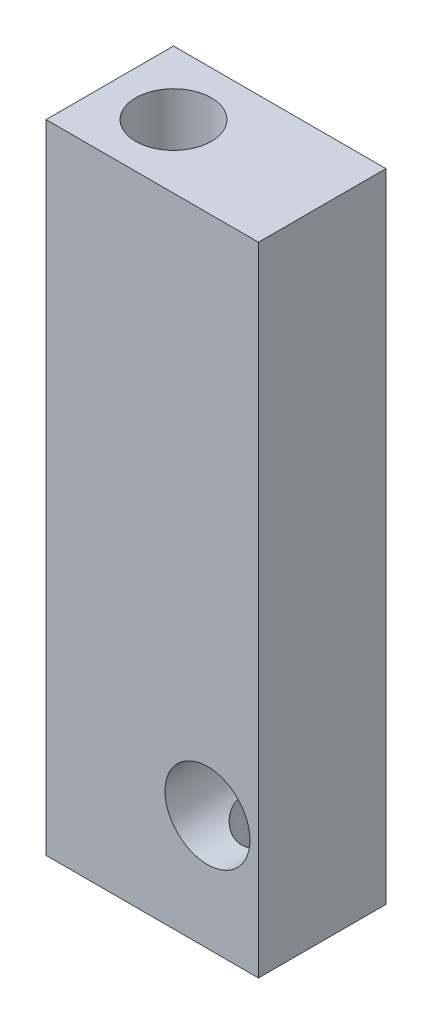
ISO-10303-21;
HEADER;
FILE_DESCRIPTION(('STEP AP214'),'2;1');
FILE_NAME('part.step','',(''),(''),'','','');
FILE_SCHEMA(('AUTOMOTIVE_DESIGN { 1 0 10303 214 1 1 1 1 }'));
ENDSEC;
DATA;
#1=APPLICATION_CONTEXT('core data for automotive mechanical design processes');
#2=APPLICATION_PROTOCOL_DEFINITION('international standard','automotive_design',2000,#1);
#3=PRODUCT_CONTEXT('',#1,'mechanical');
#4=PRODUCT('Part','Part','',(#3));
#5=PRODUCT_RELATED_PRODUCT_CATEGORY('part','',(#4));
#6=PRODUCT_DEFINITION_FORMATION('','',#4);
#7=PRODUCT_DEFINITION_CONTEXT('part definition',#1,'design');
#8=PRODUCT_DEFINITION('design','',#6,#7);
#9=PRODUCT_DEFINITION_SHAPE('','',#8);
#10=(LENGTH_UNIT() NAMED_UNIT(*) SI_UNIT(.MILLI.,.METRE.));
#11=(NAMED_UNIT(*) PLANE_ANGLE_UNIT() SI_UNIT($,.RADIAN.));
#12=(NAMED_UNIT(*) SI_UNIT($,.STERADIAN.) SOLID_ANGLE_UNIT());
#13=UNCERTAINTY_MEASURE_WITH_UNIT(LENGTH_MEASURE(1.E-05),#10,'distance_accuracy_value','');
#14=(GEOMETRIC_REPRESENTATION_CONTEXT(3) GLOBAL_UNCERTAINTY_ASSIGNED_CONTEXT((#13)) GLOBAL_UNIT_ASSIGNED_CONTEXT((#10,
#11,#12)) REPRESENTATION_CONTEXT('',''));
#15=CARTESIAN_POINT('',(0.,0.,0.));
#16=DIRECTION('',(0.,0.,1.));
#17=DIRECTION('',(1.,0.,0.));
#18=AXIS2_PLACEMENT_3D('',#15,#16,#17);
#19=CARTESIAN_POINT('',(3.175,-19.05,1.905));
#20=DIRECTION('',(1.,0.,0.));
#21=DIRECTION('',(0.,0.,-1.));
#22=AXIS2_PLACEMENT_3D('',#19,#20,#21);
#23=PLANE('',#22);
#24=DIRECTION('',(0.,0.,-1.));
#25=VECTOR('',#24,1.);
#26=CARTESIAN_POINT('',(3.175,0.,1.905));
#27=LINE('',#26,#25);
#28=CARTESIAN_POINT('',(3.175,0.,1.905));
#29=VERTEX_POINT('',#28);
#30=CARTESIAN_POINT('',(3.175,0.,-1.905));
#31=VERTEX_POINT('',#30);
#32=EDGE_CURVE('E97',#29,#31,#27,.T.);
#33=ORIENTED_EDGE('',*,*,#32,.F.);
#34=DIRECTION('',(0.,1.,0.));
#35=VECTOR('',#34,1.);
#36=CARTESIAN_POINT('',(3.175,-19.05,1.905));
#37=LINE('',#36,#35);
#38=CARTESIAN_POINT('',(3.175,-19.05,1.905));
#39=VERTEX_POINT('',#38);
#40=EDGE_CURVE('E11',#39,#29,#37,.T.);
#41=ORIENTED_EDGE('',*,*,#40,.F.);
#42=DIRECTION('',(0.,0.,-1.));
#43=VECTOR('',#42,1.);
#44=CARTESIAN_POINT('',(3.175,-19.05,1.905));
#45=LINE('',#44,#43);
#46=CARTESIAN_POINT('',(3.175,-19.05,-1.905));
#47=VERTEX_POINT('',#46);
#48=EDGE_CURVE('E108',#39,#47,#45,.T.);
#49=ORIENTED_EDGE('',*,*,#48,.T.);
#50=DIRECTION('',(0.,1.,0.));
#51=VECTOR('',#50,1.);
#52=CARTESIAN_POINT('',(3.175,-19.05,-1.905));
#53=LINE('',#52,#51);
#54=EDGE_CURVE('E41',#47,#31,#53,.T.);
#55=ORIENTED_EDGE('',*,*,#54,.T.);
#56=EDGE_LOOP('',(#33,#41,#49,#55));
#57=FACE_BOUND('',#56,.T.);
#58=ADVANCED_FACE('F38',(#57),#23,.T.);
#59=CARTESIAN_POINT('',(-3.175,-19.05,1.905));
#60=DIRECTION('',(0.,0.,1.));
#61=DIRECTION('',(1.,0.,0.));
#62=AXIS2_PLACEMENT_3D('',#59,#60,#61);
#63=PLANE('',#62);
#64=CARTESIAN_POINT('',(1.651,-15.60576,1.905));
#65=DIRECTION('',(0.,0.,1.));
#66=DIRECTION('',(1.,0.,0.));
#67=AXIS2_PLACEMENT_3D('',#64,#65,#66);
#68=CIRCLE('',#67,1.27);
#69=CARTESIAN_POINT('',(2.921,-15.60576,1.905));
#70=VERTEX_POINT('',#69);
#71=EDGE_CURVE('E155',#70,#70,#68,.T.);
#72=ORIENTED_EDGE('',*,*,#71,.F.);
#73=EDGE_LOOP('',(#72));
#74=FACE_BOUND('',#73,.T.);
#75=DIRECTION('',(1.,0.,0.));
#76=VECTOR('',#75,1.);
#77=CARTESIAN_POINT('',(-3.175,0.,1.905));
#78=LINE('',#77,#76);
#79=CARTESIAN_POINT('',(-3.175,0.,1.905));
#80=VERTEX_POINT('',#79);
#81=EDGE_CURVE('E111',#80,#29,#78,.T.);
#82=ORIENTED_EDGE('',*,*,#81,.F.);
#83=DIRECTION('',(0.,1.,0.));
#84=VECTOR('',#83,1.);
#85=CARTESIAN_POINT('',(-3.175,-19.05,1.905));
#86=LINE('',#85,#84);
#87=CARTESIAN_POINT('',(-3.175,-19.05,1.905));
#88=VERTEX_POINT('',#87);
#89=EDGE_CURVE('E47',#88,#80,#86,.T.);
#90=ORIENTED_EDGE('',*,*,#89,.F.);
#91=DIRECTION('',(1.,0.,0.));
#92=VECTOR('',#91,1.);
#93=CARTESIAN_POINT('',(-3.175,-19.05,1.905));
#94=LINE('',#93,#92);
#95=EDGE_CURVE('E115',#88,#39,#94,.T.);
#96=ORIENTED_EDGE('',*,*,#95,.T.);
#97=ORIENTED_EDGE('',*,*,#40,.T.);
#98=EDGE_LOOP('',(#82,#90,#96,#97));
#99=FACE_BOUND('',#98,.T.);
#100=ADVANCED_FACE('F126',(#74,#99),#63,.T.);
#101=CARTESIAN_POINT('',(-3.175,-19.05,1.905));
#102=DIRECTION('',(-1.,0.,0.));
#103=DIRECTION('',(0.,0.,1.));
#104=AXIS2_PLACEMENT_3D('',#101,#102,#103);
#105=PLANE('',#104);
#106=DIRECTION('',(0.,0.,1.));
#107=VECTOR('',#106,1.);
#108=CARTESIAN_POINT('',(-3.175,0.,1.905));
#109=LINE('',#108,#107);
#110=CARTESIAN_POINT('',(-3.175,0.,-1.905));
#111=VERTEX_POINT('',#110);
#112=EDGE_CURVE('E119',#111,#80,#109,.T.);
#113=ORIENTED_EDGE('',*,*,#112,.F.);
#114=DIRECTION('',(0.,1.,0.));
#115=VECTOR('',#114,1.);
#116=CARTESIAN_POINT('',(-3.175,-19.05,-1.905));
#117=LINE('',#116,#115);
#118=CARTESIAN_POINT('',(-3.175,-19.05,-1.905));
#119=VERTEX_POINT('',#118);
#120=EDGE_CURVE('E123',#119,#111,#117,.T.);
#121=ORIENTED_EDGE('',*,*,#120,.F.);
#122=DIRECTION('',(0.,0.,1.));
#123=VECTOR('',#122,1.);
#124=CARTESIAN_POINT('',(-3.175,-19.05,1.905));
#125=LINE('',#124,#123);
#126=EDGE_CURVE('E113',#119,#88,#125,.T.);
#127=ORIENTED_EDGE('',*,*,#126,.T.);
#128=ORIENTED_EDGE('',*,*,#89,.T.);
#129=EDGE_LOOP('',(#113,#121,#127,#128));
#130=FACE_BOUND('',#129,.T.);
#131=ADVANCED_FACE('F129',(#130),#105,.T.);
#132=CARTESIAN_POINT('',(-3.175,-19.05,-1.905));
#133=DIRECTION('',(0.,0.,-1.));
#134=DIRECTION('',(-1.,0.,0.));
#135=AXIS2_PLACEMENT_3D('',#132,#133,#134);
#136=PLANE('',#135);
#137=CARTESIAN_POINT('',(1.651,-15.60576,-1.905));
#138=DIRECTION('',(0.,0.,1.));
#139=DIRECTION('',(1.,0.,0.));
#140=AXIS2_PLACEMENT_3D('',#137,#138,#139);
#141=CIRCLE('',#140,1.27);
#142=CARTESIAN_POINT('',(2.921,-15.60576,-1.905));
#143=VERTEX_POINT('',#142);
#144=EDGE_CURVE('E104',#143,#143,#141,.T.);
#145=ORIENTED_EDGE('',*,*,#144,.T.);
#146=EDGE_LOOP('',(#145));
#147=FACE_BOUND('',#146,.T.);
#148=DIRECTION('',(-1.,0.,0.));
#149=VECTOR('',#148,1.);
#150=CARTESIAN_POINT('',(-3.175,0.,-1.905));
#151=LINE('',#150,#149);
#152=EDGE_CURVE('E101',#31,#111,#151,.T.);
#153=ORIENTED_EDGE('',*,*,#152,.F.);
#154=ORIENTED_EDGE('',*,*,#54,.F.);
#155=DIRECTION('',(-1.,0.,0.));
#156=VECTOR('',#155,1.);
#157=CARTESIAN_POINT('',(-3.175,-19.05,-1.905));
#158=LINE('',#157,#156);
#159=EDGE_CURVE('E110',#47,#119,#158,.T.);
#160=ORIENTED_EDGE('',*,*,#159,.T.);
#161=ORIENTED_EDGE('',*,*,#120,.T.);
#162=EDGE_LOOP('',(#153,#154,#160,#161));
#163=FACE_BOUND('',#162,.T.);
#164=ADVANCED_FACE('F124',(#147,#163),#136,.T.);
#165=CARTESIAN_POINT('',(0.,-19.05,0.));
#166=DIRECTION('',(0.,-1.,0.));
#167=DIRECTION('',(0.,0.,-1.));
#168=AXIS2_PLACEMENT_3D('',#165,#166,#167);
#169=PLANE('',#168);
#170=CARTESIAN_POINT('',(1.651,-19.05,0.));
#171=DIRECTION('',(0.,-1.,0.));
#172=DIRECTION('',(0.,0.,-1.));
#173=AXIS2_PLACEMENT_3D('',#170,#171,#172);
#174=CIRCLE('',#173,0.888999999999987);
#175=CARTESIAN_POINT('',(1.651,-19.05,-0.888999999999987));
#176=VERTEX_POINT('',#175);
#177=EDGE_CURVE('E161',#176,#176,#174,.T.);
#178=ORIENTED_EDGE('',*,*,#177,.F.);
#179=EDGE_LOOP('',(#178));
#180=FACE_BOUND('',#179,.T.);
#181=ORIENTED_EDGE('',*,*,#48,.F.);
#182=ORIENTED_EDGE('',*,*,#95,.F.);
#183=ORIENTED_EDGE('',*,*,#126,.F.);
#184=ORIENTED_EDGE('',*,*,#159,.F.);
#185=EDGE_LOOP('',(#181,#182,#183,#184));
#186=FACE_BOUND('',#185,.T.);
#187=ADVANCED_FACE('F131',(#180,#186),#169,.T.);
#188=CARTESIAN_POINT('',(0.,0.,0.));
#189=DIRECTION('',(0.,-1.,0.));
#190=DIRECTION('',(0.,0.,-1.));
#191=AXIS2_PLACEMENT_3D('',#188,#189,#190);
#192=PLANE('',#191);
#193=CARTESIAN_POINT('',(-1.27,0.,0.));
#194=DIRECTION('',(0.,1.,0.));
#195=DIRECTION('',(0.,0.,1.));
#196=AXIS2_PLACEMENT_3D('',#193,#194,#195);
#197=CIRCLE('',#196,1.13029999999999);
#198=CARTESIAN_POINT('',(-1.27,0.,1.13029999999999));
#199=VERTEX_POINT('',#198);
#200=EDGE_CURVE('E98',#199,#199,#197,.T.);
#201=ORIENTED_EDGE('',*,*,#200,.F.);
#202=EDGE_LOOP('',(#201));
#203=FACE_BOUND('',#202,.T.);
#204=ORIENTED_EDGE('',*,*,#32,.T.);
#205=ORIENTED_EDGE('',*,*,#152,.T.);
#206=ORIENTED_EDGE('',*,*,#112,.T.);
#207=ORIENTED_EDGE('',*,*,#81,.T.);
#208=EDGE_LOOP('',(#204,#205,#206,#207));
#209=FACE_BOUND('',#208,.T.);
#210=ADVANCED_FACE('F91',(#203,#209),#192,.F.);
#211=CARTESIAN_POINT('',(-1.27,-7.62,0.));
#212=DIRECTION('',(0.,1.,0.));
#213=DIRECTION('',(0.,0.,1.));
#214=AXIS2_PLACEMENT_3D('',#211,#212,#213);
#215=CONICAL_SURFACE('',#214,1.13029999999999,1.02974425867665);
#216=CARTESIAN_POINT('',(-1.27,-8.29915275768685,0.));
#217=VERTEX_POINT('',#216);
#218=VERTEX_LOOP('',#217);
#219=FACE_BOUND('',#218,.T.);
#220=CARTESIAN_POINT('',(-1.27,-7.62,0.));
#221=DIRECTION('',(0.,1.,0.));
#222=DIRECTION('',(0.,0.,1.));
#223=AXIS2_PLACEMENT_3D('',#220,#221,#222);
#224=CIRCLE('',#223,1.13029999999999);
#225=CARTESIAN_POINT('',(-1.27,-7.62,1.13029999999999));
#226=VERTEX_POINT('',#225);
#227=EDGE_CURVE('E95',#226,#226,#224,.T.);
#228=ORIENTED_EDGE('',*,*,#227,.T.);
#229=EDGE_LOOP('',(#228));
#230=FACE_BOUND('',#229,.T.);
#231=ADVANCED_FACE('F87',(#219,#230),#215,.F.);
#232=CARTESIAN_POINT('',(-1.27,0.,0.));
#233=DIRECTION('',(0.,1.,0.));
#234=DIRECTION('',(0.,0.,1.));
#235=AXIS2_PLACEMENT_3D('',#232,#233,#234);
#236=CYLINDRICAL_SURFACE('',#235,1.13029999999999);
#237=ORIENTED_EDGE('',*,*,#227,.F.);
#238=EDGE_LOOP('',(#237));
#239=FACE_BOUND('',#238,.T.);
#240=ORIENTED_EDGE('',*,*,#200,.T.);
#241=EDGE_LOOP('',(#240));
#242=FACE_BOUND('',#241,.T.);
#243=ADVANCED_FACE('F90',(#239,#242),#236,.F.);
#244=CARTESIAN_POINT('',(1.651,-15.60576,-1.905));
#245=DIRECTION('',(0.,0.,1.));
#246=DIRECTION('',(1.,0.,0.));
#247=AXIS2_PLACEMENT_3D('',#244,#245,#246);
#248=CYLINDRICAL_SURFACE('',#247,1.27);
#249=CARTESIAN_POINT('',(1.651,-16.87576,-0.888999999999993));
#250=CARTESIAN_POINT('',(1.69520985856038,-16.8757621231107,-0.889002293614275));
#251=CARTESIAN_POINT('',(1.73940791377723,-16.8734330924957,-0.885685048350347));
#252=CARTESIAN_POINT('',(1.82637877140825,-16.8643522508823,-0.872638182748699));
#253=CARTESIAN_POINT('',(1.86915114803012,-16.8575991308079,-0.862906664439805));
#254=CARTESIAN_POINT('',(1.95187876962086,-16.8403254937155,-0.837649704148341));
#255=CARTESIAN_POINT('',(1.99184655034182,-16.8298232141954,-0.82215229475671));
#256=CARTESIAN_POINT('',(2.06842152305637,-16.8058728374849,-0.78604966068939));
#257=CARTESIAN_POINT('',(2.10502822356792,-16.7924243104428,-0.765443690627));
#258=CARTESIAN_POINT('',(2.1774991271549,-16.762208386881,-0.717750090039023));
#259=CARTESIAN_POINT('',(2.21301218301731,-16.7452527691071,-0.690250725814769));
#260=CARTESIAN_POINT('',(2.27924215366177,-16.7101243170559,-0.630574252028733));
#261=CARTESIAN_POINT('',(2.30995174500995,-16.6919496833738,-0.598390141503373));
#262=CARTESIAN_POINT('',(2.37124965052125,-16.6525112610016,-0.52372832325559));
#263=CARTESIAN_POINT('',(2.40086471506084,-16.6312669535852,-0.480435938575854));
#264=CARTESIAN_POINT('',(2.45241613829321,-16.5915033335513,-0.388363084960961));
#265=CARTESIAN_POINT('',(2.4743653395883,-16.5729794938129,-0.339591977493894));
#266=CARTESIAN_POINT('',(2.50400950316551,-16.5467904023938,-0.253145209392162));
#267=CARTESIAN_POINT('',(2.51401494725038,-16.5375401894363,-0.216747917682053));
#268=CARTESIAN_POINT('',(2.52936859443232,-16.5230832019971,-0.142233112968697));
#269=CARTESIAN_POINT('',(2.53472591478366,-16.5178685140502,-0.104119122517421));
#270=CARTESIAN_POINT('',(2.54043829956461,-16.5123017262679,-0.0269255092800132));
#271=CARTESIAN_POINT('',(2.54076467963489,-16.5119775101226,0.0121583790184601));
#272=CARTESIAN_POINT('',(2.53631172777489,-16.5163263915972,0.0897619360053206));
#273=CARTESIAN_POINT('',(2.53152888424551,-16.5210029262646,0.128281198166042));
#274=CARTESIAN_POINT('',(2.51769232418687,-16.534105681041,0.201124287261301));
#275=CARTESIAN_POINT('',(2.50894141037512,-16.5422639698316,0.235557206491254));
#276=CARTESIAN_POINT('',(2.48770354055884,-16.561286287639,0.302459980192075));
#277=CARTESIAN_POINT('',(2.47521358930994,-16.5721524847161,0.334928235660962));
#278=CARTESIAN_POINT('',(2.43932021187356,-16.6018727106425,0.414307107955654));
#279=CARTESIAN_POINT('',(2.41364109879763,-16.6219079337972,0.459751606988151));
#280=CARTESIAN_POINT('',(2.35513209200744,-16.663298741226,0.545166512722875));
#281=CARTESIAN_POINT('',(2.32228765586349,-16.684656946504,0.585125513588377));
#282=CARTESIAN_POINT('',(2.24946212414262,-16.7267120888326,0.659470735027001));
#283=CARTESIAN_POINT('',(2.20940073739025,-16.7473981293056,0.693784964465397));
#284=CARTESIAN_POINT('',(2.12291355359411,-16.785770530123,0.755261792752236));
#285=CARTESIAN_POINT('',(2.0765012592763,-16.8034630810873,0.782439216640202));
#286=CARTESIAN_POINT('',(1.98908250375917,-16.8305902450581,0.823290305277435));
#287=CARTESIAN_POINT('',(1.94914856240523,-16.8409857516479,0.838620966326899));
#288=CARTESIAN_POINT('',(1.86674552193162,-16.8580054294244,0.863494445563669));
#289=CARTESIAN_POINT('',(1.8242781712576,-16.8646321691233,0.87304120591959));
#290=CARTESIAN_POINT('',(1.73776680190562,-16.8735410783827,0.885839300306575));
#291=CARTESIAN_POINT('',(1.6937171155662,-16.8758056195955,0.88906509118107));
#292=CARTESIAN_POINT('',(1.60563166864485,-16.8757129967681,0.888932932191327));
#293=CARTESIAN_POINT('',(1.56159590752364,-16.8733560415413,0.885575279787304));
#294=CARTESIAN_POINT('',(1.47780281247266,-16.8645543029456,0.872927598447046));
#295=CARTESIAN_POINT('',(1.43795380637682,-16.8583863157852,0.86403899675515));
#296=CARTESIAN_POINT('',(1.3604554517747,-16.8427112317709,0.841153181630434));
#297=CARTESIAN_POINT('',(1.32280651510579,-16.8332035120635,0.82715501525462));
#298=CARTESIAN_POINT('',(1.24781614796086,-16.8107421140475,0.793455737336303));
#299=CARTESIAN_POINT('',(1.21068458952832,-16.7975923517882,0.773421434615644));
#300=CARTESIAN_POINT('',(1.14019023853037,-16.7691263469327,0.728791902535904));
#301=CARTESIAN_POINT('',(1.10682983606806,-16.7538087440853,0.704193806504695));
#302=CARTESIAN_POINT('',(1.0388005871589,-16.7192251403481,0.646414653962999));
#303=CARTESIAN_POINT('',(1.00488298219015,-16.6997318007955,0.61248519273874));
#304=CARTESIAN_POINT('',(0.94289928392298,-16.6606703106966,0.539633869057656));
#305=CARTESIAN_POINT('',(0.914837827400149,-16.6411021132682,0.500708089706288));
#306=CARTESIAN_POINT('',(0.867408099809572,-16.6055975934942,0.422142277325051));
#307=CARTESIAN_POINT('',(0.847464847540392,-16.5894929173475,0.382927207694919));
#308=CARTESIAN_POINT('',(0.813317551961624,-16.5605844795324,0.300950571813666));
#309=CARTESIAN_POINT('',(0.799102294496054,-16.5477742859636,0.258196134747841));
#310=CARTESIAN_POINT('',(0.779400752294106,-16.5295341247968,0.178756418943304));
#311=CARTESIAN_POINT('',(0.772730383778598,-16.5231354159864,0.142592997194255));
#312=CARTESIAN_POINT('',(0.763933369066159,-16.5146342735673,0.0692369918938265));
#313=CARTESIAN_POINT('',(0.761800833667631,-16.5125262716321,0.0320458057897463));
#314=CARTESIAN_POINT('',(0.762228888933618,-16.5129456826249,-0.0423266103184602));
#315=CARTESIAN_POINT('',(0.764795118716524,-16.5154786653296,-0.0795077747292014));
#316=CARTESIAN_POINT('',(0.774440764887366,-16.5247738638228,-0.152756475041464));
#317=CARTESIAN_POINT('',(0.78152677219331,-16.5315422555785,-0.188822303854283));
#318=CARTESIAN_POINT('',(0.802395675983813,-16.5507585227873,-0.268997710121997));
#319=CARTESIAN_POINT('',(0.817505045681073,-16.56427076798,-0.312500865597542));
#320=CARTESIAN_POINT('',(0.853644253638989,-16.5945360591007,-0.395743453710887));
#321=CARTESIAN_POINT('',(0.874683292728837,-16.6112941287031,-0.435476907964087));
#322=CARTESIAN_POINT('',(0.922682191038828,-16.6466069416595,-0.511813979953886));
#323=CARTESIAN_POINT('',(0.949770996583917,-16.665194942879,-0.548320653870265));
#324=CARTESIAN_POINT('',(1.00922147039188,-16.7022310772034,-0.616846615924958));
#325=CARTESIAN_POINT('',(1.04158488264288,-16.720679161928,-0.648864413332207));
#326=CARTESIAN_POINT('',(1.11776712007645,-16.7593219862957,-0.713379970487373));
#327=CARTESIAN_POINT('',(1.16259808605058,-16.7792139842835,-0.744883062466079));
#328=CARTESIAN_POINT('',(1.2586004268699,-16.8146974118904,-0.799614515319502));
#329=CARTESIAN_POINT('',(1.30976430734622,-16.8302938556605,-0.822852533236056));
#330=CARTESIAN_POINT('',(1.4088688444712,-16.8533408636692,-0.856742587258404));
#331=CARTESIAN_POINT('',(1.45613440262962,-16.8616644929153,-0.868763071802993));
#332=CARTESIAN_POINT('',(1.55260654919011,-16.8728694102116,-0.884885453654768));
#333=CARTESIAN_POINT('',(1.60181058060389,-16.8757576377535,-0.888997448045327));
#334=CARTESIAN_POINT('',(1.651,-16.87576,-0.888999999999993));
#335=B_SPLINE_CURVE_WITH_KNOTS('',3,(#249,#250,#251,#252,#253,#254,#255,#256,#257,#258,#259,
#260,#261,#262,#263,#264,#265,#266,#267,#268,#269,#270,#271,#272,#273,#274,#275,#276,#277,#278,
#279,#280,#281,#282,#283,#284,#285,#286,#287,#288,#289,#290,#291,#292,#293,#294,#295,#296,#297,
#298,#299,#300,#301,#302,#303,#304,#305,#306,#307,#308,#309,#310,#311,#312,#313,#314,#315,#316,
#317,#318,#319,#320,#321,#322,#323,#324,#325,#326,#327,#328,#329,#330,#331,#332,#333,#334),
.UNSPECIFIED.,.T.,.F.,(4,2,2,2,2,2,2,2,2,2,2,2,2,2,2,2,2,2,2,2,2,2,2,2,2,2,2,2,2,2,2,2,2,2,2,2,
2,2,2,2,2,2,4),(0.,0.132431423868691,0.264902051545758,0.396736875491973,0.528590946702779,
0.672090773941071,0.815807294332868,0.984826394994508,1.15356096459533,1.26971521122424,
1.38564110385924,1.50222771549897,1.61889450938221,1.72785912842791,1.83691127080593,
2.00376233902827,2.17095524462615,2.34013816750845,2.50896682165598,2.64048002913021,
2.77190349920545,2.90385696761786,3.03580447410415,3.15914148906437,3.28250151836229,
3.41458186438679,3.54674545713734,3.70150240073282,3.85638141659114,3.99643646278366,
4.13621596393902,4.2477191925485,4.35907762374398,4.47056978688749,4.58222490516131,
4.72542714223254,4.8688528154721,5.01569050836511,5.16257685031715,5.33647710186237,
5.51017349292346,5.65770977133918,5.80505755895999),.UNSPECIFIED.);
#336=CARTESIAN_POINT('',(1.651,-16.87576,-0.888999999999993));
#337=VERTEX_POINT('',#336);
#338=EDGE_CURVE('E157',#337,#337,#335,.T.);
#339=ORIENTED_EDGE('',*,*,#338,.T.);
#340=EDGE_LOOP('',(#339));
#341=FACE_BOUND('',#340,.T.);
#342=ORIENTED_EDGE('',*,*,#144,.F.);
#343=EDGE_LOOP('',(#342));
#344=FACE_BOUND('',#343,.T.);
#345=ORIENTED_EDGE('',*,*,#71,.T.);
#346=EDGE_LOOP('',(#345));
#347=FACE_BOUND('',#346,.T.);
#348=ADVANCED_FACE('F173',(#341,#344,#347),#248,.F.);
#349=CARTESIAN_POINT('',(1.651,-19.05,0.));
#350=DIRECTION('',(0.,-1.,0.));
#351=DIRECTION('',(0.,0.,-1.));
#352=AXIS2_PLACEMENT_3D('',#349,#350,#351);
#353=CYLINDRICAL_SURFACE('',#352,0.888999999999993);
#354=ORIENTED_EDGE('',*,*,#338,.F.);
#355=EDGE_LOOP('',(#354));
#356=FACE_BOUND('',#355,.T.);
#357=ORIENTED_EDGE('',*,*,#177,.T.);
#358=EDGE_LOOP('',(#357));
#359=FACE_BOUND('',#358,.T.);
#360=ADVANCED_FACE('F170',(#356,#359),#353,.F.);
#361=CLOSED_SHELL('',(#58,#100,#131,#164,#187,#210,#231,#243,#348,#360));
#362=MANIFOLD_SOLID_BREP('B2',#361);
#363=ADVANCED_BREP_SHAPE_REPRESENTATION('',(#18,#362),#14);
#364=SHAPE_DEFINITION_REPRESENTATION(#9,#363);
ENDSEC;
END-ISO-10303-21;
